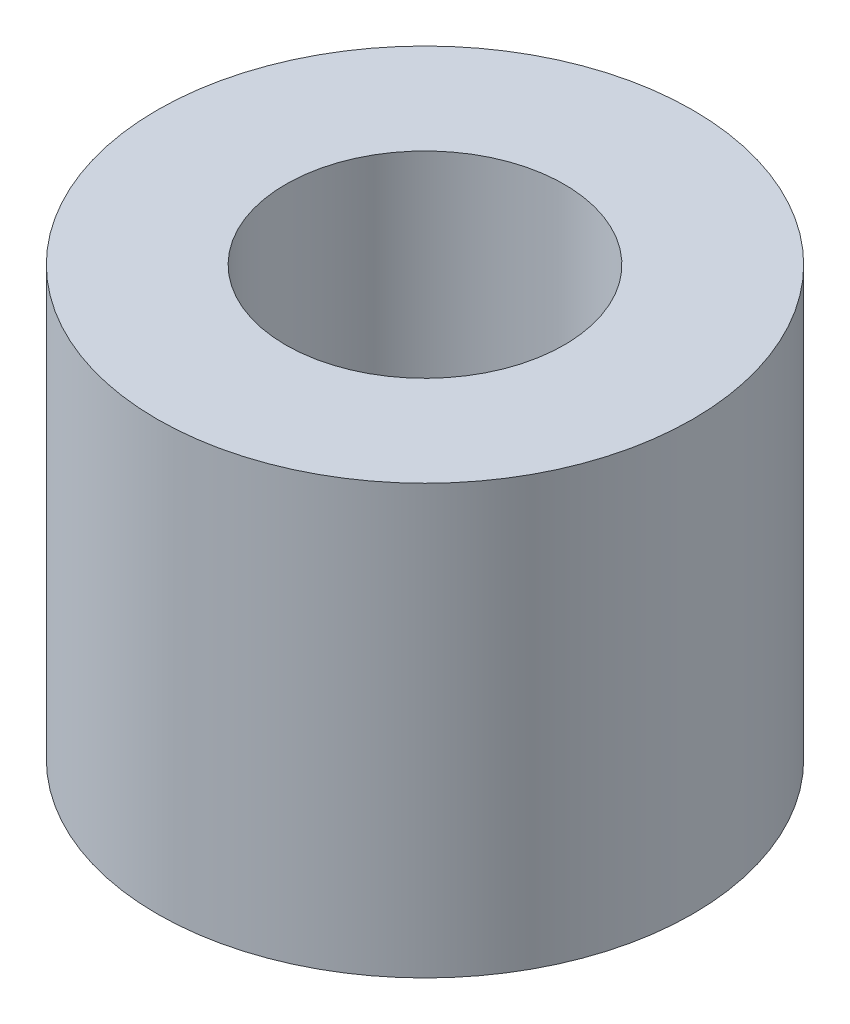
ISO-10303-21;
HEADER;
FILE_DESCRIPTION(('STEP AP214'),'2;1');
FILE_NAME('part.step','',(''),(''),'','','');
FILE_SCHEMA(('AUTOMOTIVE_DESIGN { 1 0 10303 214 1 1 1 1 }'));
ENDSEC;
DATA;
#1=APPLICATION_CONTEXT('core data for automotive mechanical design processes');
#2=APPLICATION_PROTOCOL_DEFINITION('international standard','automotive_design',2000,#1);
#3=PRODUCT_CONTEXT('',#1,'mechanical');
#4=PRODUCT('Part','Part','',(#3));
#5=PRODUCT_RELATED_PRODUCT_CATEGORY('part','',(#4));
#6=PRODUCT_DEFINITION_FORMATION('','',#4);
#7=PRODUCT_DEFINITION_CONTEXT('part definition',#1,'design');
#8=PRODUCT_DEFINITION('design','',#6,#7);
#9=PRODUCT_DEFINITION_SHAPE('','',#8);
#10=(LENGTH_UNIT() NAMED_UNIT(*) SI_UNIT(.MILLI.,.METRE.));
#11=(NAMED_UNIT(*) PLANE_ANGLE_UNIT() SI_UNIT($,.RADIAN.));
#12=(NAMED_UNIT(*) SI_UNIT($,.STERADIAN.) SOLID_ANGLE_UNIT());
#13=UNCERTAINTY_MEASURE_WITH_UNIT(LENGTH_MEASURE(1.E-05),#10,'distance_accuracy_value','');
#14=(GEOMETRIC_REPRESENTATION_CONTEXT(3) GLOBAL_UNCERTAINTY_ASSIGNED_CONTEXT((#13)) GLOBAL_UNIT_ASSIGNED_CONTEXT((#10,
#11,#12)) REPRESENTATION_CONTEXT('',''));
#15=CARTESIAN_POINT('',(0.,0.,0.));
#16=DIRECTION('',(0.,0.,1.));
#17=DIRECTION('',(1.,0.,0.));
#18=AXIS2_PLACEMENT_3D('',#15,#16,#17);
#19=CARTESIAN_POINT('',(0.,8.,0.));
#20=DIRECTION('',(0.,1.,0.));
#21=DIRECTION('',(0.,0.,1.));
#22=AXIS2_PLACEMENT_3D('',#19,#20,#21);
#23=PLANE('',#22);
#24=CARTESIAN_POINT('',(0.,8.,0.));
#25=DIRECTION('',(0.,1.,0.));
#26=DIRECTION('',(0.,0.,1.));
#27=AXIS2_PLACEMENT_3D('',#24,#25,#26);
#28=CIRCLE('',#27,5.);
#29=CARTESIAN_POINT('',(0.,8.,5.));
#30=VERTEX_POINT('',#29);
#31=EDGE_CURVE('E10',#30,#30,#28,.T.);
#32=ORIENTED_EDGE('',*,*,#31,.T.);
#33=EDGE_LOOP('',(#32));
#34=FACE_BOUND('',#33,.T.);
#35=CARTESIAN_POINT('',(0.,8.,0.));
#36=DIRECTION('',(0.,1.,0.));
#37=DIRECTION('',(0.,0.,1.));
#38=AXIS2_PLACEMENT_3D('',#35,#36,#37);
#39=CIRCLE('',#38,2.6);
#40=CARTESIAN_POINT('',(0.,8.,2.6));
#41=VERTEX_POINT('',#40);
#42=EDGE_CURVE('E47',#41,#41,#39,.T.);
#43=ORIENTED_EDGE('',*,*,#42,.F.);
#44=EDGE_LOOP('',(#43));
#45=FACE_BOUND('',#44,.T.);
#46=ADVANCED_FACE('F36',(#34,#45),#23,.T.);
#47=CARTESIAN_POINT('',(0.,0.,0.));
#48=DIRECTION('',(0.,1.,0.));
#49=DIRECTION('',(0.,0.,1.));
#50=AXIS2_PLACEMENT_3D('',#47,#48,#49);
#51=PLANE('',#50);
#52=CARTESIAN_POINT('',(0.,0.,0.));
#53=DIRECTION('',(0.,1.,0.));
#54=DIRECTION('',(0.,0.,1.));
#55=AXIS2_PLACEMENT_3D('',#52,#53,#54);
#56=CIRCLE('',#55,5.);
#57=CARTESIAN_POINT('',(0.,0.,5.));
#58=VERTEX_POINT('',#57);
#59=EDGE_CURVE('E40',#58,#58,#56,.T.);
#60=ORIENTED_EDGE('',*,*,#59,.F.);
#61=EDGE_LOOP('',(#60));
#62=FACE_BOUND('',#61,.T.);
#63=CARTESIAN_POINT('',(0.,0.,0.));
#64=DIRECTION('',(0.,1.,0.));
#65=DIRECTION('',(0.,0.,1.));
#66=AXIS2_PLACEMENT_3D('',#63,#64,#65);
#67=CIRCLE('',#66,2.6);
#68=CARTESIAN_POINT('',(0.,0.,2.6));
#69=VERTEX_POINT('',#68);
#70=EDGE_CURVE('E49',#69,#69,#67,.T.);
#71=ORIENTED_EDGE('',*,*,#70,.T.);
#72=EDGE_LOOP('',(#71));
#73=FACE_BOUND('',#72,.T.);
#74=ADVANCED_FACE('F59',(#62,#73),#51,.F.);
#75=CARTESIAN_POINT('',(0.,8.,0.));
#76=DIRECTION('',(0.,-1.,0.));
#77=DIRECTION('',(0.,0.,-1.));
#78=AXIS2_PLACEMENT_3D('',#75,#76,#77);
#79=CYLINDRICAL_SURFACE('',#78,5.);
#80=ORIENTED_EDGE('',*,*,#31,.F.);
#81=EDGE_LOOP('',(#80));
#82=FACE_BOUND('',#81,.T.);
#83=ORIENTED_EDGE('',*,*,#59,.T.);
#84=EDGE_LOOP('',(#83));
#85=FACE_BOUND('',#84,.T.);
#86=ADVANCED_FACE('F38',(#82,#85),#79,.T.);
#87=CARTESIAN_POINT('',(0.,8.,0.));
#88=DIRECTION('',(0.,-1.,0.));
#89=DIRECTION('',(0.,0.,-1.));
#90=AXIS2_PLACEMENT_3D('',#87,#88,#89);
#91=CYLINDRICAL_SURFACE('',#90,2.6);
#92=ORIENTED_EDGE('',*,*,#42,.T.);
#93=EDGE_LOOP('',(#92));
#94=FACE_BOUND('',#93,.T.);
#95=ORIENTED_EDGE('',*,*,#70,.F.);
#96=EDGE_LOOP('',(#95));
#97=FACE_BOUND('',#96,.T.);
#98=ADVANCED_FACE('F55',(#94,#97),#91,.F.);
#99=CLOSED_SHELL('',(#46,#74,#86,#98));
#100=MANIFOLD_SOLID_BREP('B2',#99);
#101=ADVANCED_BREP_SHAPE_REPRESENTATION('',(#18,#100),#14);
#102=SHAPE_DEFINITION_REPRESENTATION(#9,#101);
ENDSEC;
END-ISO-10303-21;
